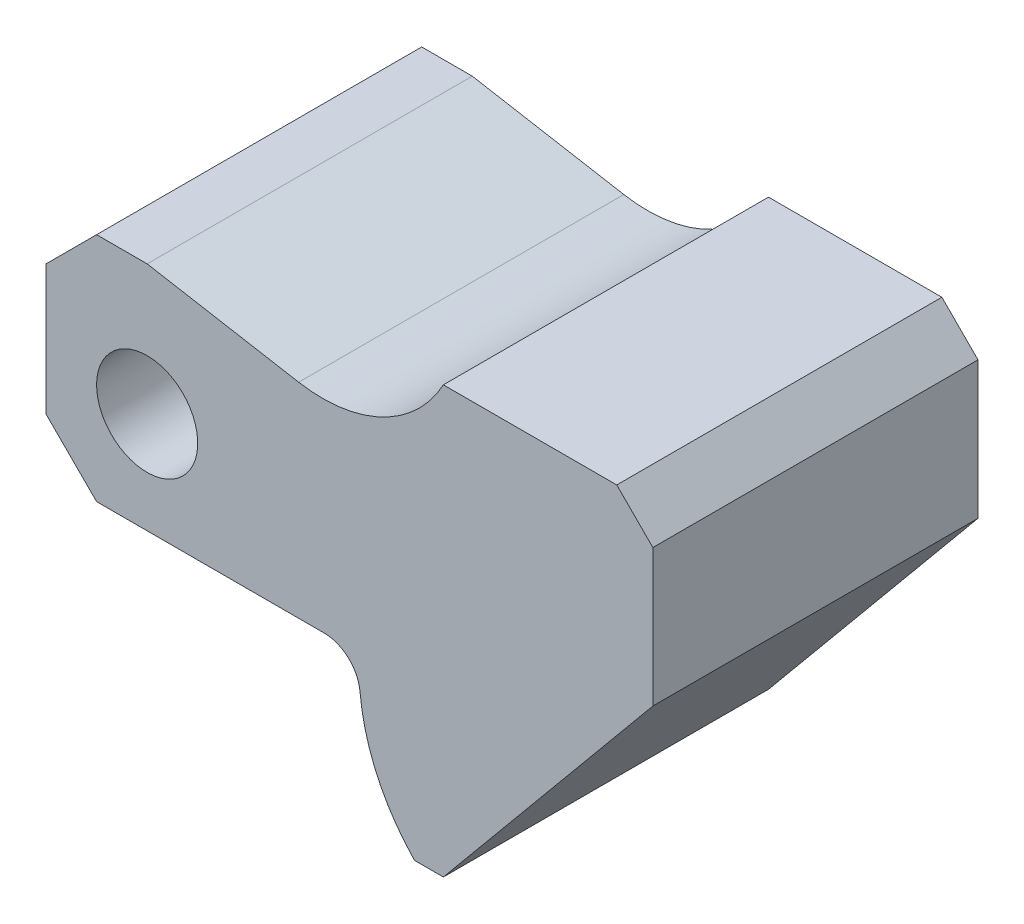
ISO-10303-21;
HEADER;
FILE_DESCRIPTION(('STEP AP214'),'2;1');
FILE_NAME('part.step','',(''),(''),'','','');
FILE_SCHEMA(('AUTOMOTIVE_DESIGN { 1 0 10303 214 1 1 1 1 }'));
ENDSEC;
DATA;
#1=APPLICATION_CONTEXT('core data for automotive mechanical design processes');
#2=APPLICATION_PROTOCOL_DEFINITION('international standard','automotive_design',2000,#1);
#3=PRODUCT_CONTEXT('',#1,'mechanical');
#4=PRODUCT('Part','Part','',(#3));
#5=PRODUCT_RELATED_PRODUCT_CATEGORY('part','',(#4));
#6=PRODUCT_DEFINITION_FORMATION('','',#4);
#7=PRODUCT_DEFINITION_CONTEXT('part definition',#1,'design');
#8=PRODUCT_DEFINITION('design','',#6,#7);
#9=PRODUCT_DEFINITION_SHAPE('','',#8);
#10=(LENGTH_UNIT() NAMED_UNIT(*) SI_UNIT(.MILLI.,.METRE.));
#11=(NAMED_UNIT(*) PLANE_ANGLE_UNIT() SI_UNIT($,.RADIAN.));
#12=(NAMED_UNIT(*) SI_UNIT($,.STERADIAN.) SOLID_ANGLE_UNIT());
#13=UNCERTAINTY_MEASURE_WITH_UNIT(LENGTH_MEASURE(1.E-05),#10,'distance_accuracy_value','');
#14=(GEOMETRIC_REPRESENTATION_CONTEXT(3) GLOBAL_UNCERTAINTY_ASSIGNED_CONTEXT((#13)) GLOBAL_UNIT_ASSIGNED_CONTEXT((#10,
#11,#12)) REPRESENTATION_CONTEXT('',''));
#15=CARTESIAN_POINT('',(0.,0.,0.));
#16=DIRECTION('',(0.,0.,1.));
#17=DIRECTION('',(1.,0.,0.));
#18=AXIS2_PLACEMENT_3D('',#15,#16,#17);
#19=CARTESIAN_POINT('',(16.7763702650457,10.4206472101089,45.));
#20=DIRECTION('',(0.,0.,-1.));
#21=DIRECTION('',(-1.,0.,0.));
#22=AXIS2_PLACEMENT_3D('',#19,#20,#21);
#23=PLANE('',#22);
#24=CARTESIAN_POINT('',(16.7763702650457,10.4206472101089,45.));
#25=DIRECTION('',(0.,0.,-1.));
#26=DIRECTION('',(-1.,0.,0.));
#27=AXIS2_PLACEMENT_3D('',#24,#25,#26);
#28=CIRCLE('',#27,19.);
#29=CARTESIAN_POINT('',(33.5025819868144,1.4076653817368,45.));
#30=VERTEX_POINT('',#29);
#31=CARTESIAN_POINT('',(13.477054889374,-8.29070009712305,45.));
#32=VERTEX_POINT('',#31);
#33=EDGE_CURVE('E224',#30,#32,#28,.T.);
#34=ORIENTED_EDGE('',*,*,#33,.T.);
#35=DIRECTION('',(-0.984807753012208,0.173648177666931,0.));
#36=VECTOR('',#35,1.);
#37=CARTESIAN_POINT('',(-7.49741801318557,-4.5923346182632,45.));
#38=LINE('',#37,#36);
#39=CARTESIAN_POINT('',(-7.49741801318557,-4.5923346182632,45.));
#40=VERTEX_POINT('',#39);
#41=EDGE_CURVE('E124',#32,#40,#38,.T.);
#42=ORIENTED_EDGE('',*,*,#41,.T.);
#43=DIRECTION('',(-1.,0.,0.));
#44=VECTOR('',#43,1.);
#45=CARTESIAN_POINT('',(-14.4974180131856,-4.5923346182632,45.));
#46=LINE('',#45,#44);
#47=CARTESIAN_POINT('',(-14.4974180131856,-4.5923346182632,45.));
#48=VERTEX_POINT('',#47);
#49=EDGE_CURVE('E269',#40,#48,#46,.T.);
#50=ORIENTED_EDGE('',*,*,#49,.T.);
#51=DIRECTION('',(-0.707106781186547,-0.707106781186547,0.));
#52=VECTOR('',#51,1.);
#53=CARTESIAN_POINT('',(-21.4974180131856,-11.5923346182632,45.));
#54=LINE('',#53,#52);
#55=CARTESIAN_POINT('',(-21.4974180131856,-11.5923346182632,45.));
#56=VERTEX_POINT('',#55);
#57=EDGE_CURVE('E289',#48,#56,#54,.T.);
#58=ORIENTED_EDGE('',*,*,#57,.T.);
#59=DIRECTION('',(0.,-1.,0.));
#60=VECTOR('',#59,1.);
#61=CARTESIAN_POINT('',(-21.4974180131856,-29.5923346182632,45.));
#62=LINE('',#61,#60);
#63=CARTESIAN_POINT('',(-21.4974180131856,-29.5923346182632,45.));
#64=VERTEX_POINT('',#63);
#65=EDGE_CURVE('E285',#56,#64,#62,.T.);
#66=ORIENTED_EDGE('',*,*,#65,.T.);
#67=DIRECTION('',(0.707106781186549,-0.707106781186547,0.));
#68=VECTOR('',#67,1.);
#69=CARTESIAN_POINT('',(-14.4974180131855,-36.5923346182632,45.));
#70=LINE('',#69,#68);
#71=CARTESIAN_POINT('',(-14.4974180131855,-36.5923346182632,45.));
#72=VERTEX_POINT('',#71);
#73=EDGE_CURVE('E288',#64,#72,#70,.T.);
#74=ORIENTED_EDGE('',*,*,#73,.T.);
#75=DIRECTION('',(1.,0.,0.));
#76=VECTOR('',#75,1.);
#77=CARTESIAN_POINT('',(16.9842529726912,-36.5923346182632,45.));
#78=LINE('',#77,#76);
#79=CARTESIAN_POINT('',(16.9842529726912,-36.5923346182632,45.));
#80=VERTEX_POINT('',#79);
#81=EDGE_CURVE('E293',#72,#80,#78,.T.);
#82=ORIENTED_EDGE('',*,*,#81,.T.);
#83=CARTESIAN_POINT('',(16.9842529726912,-41.5923346182632,45.));
#84=DIRECTION('',(0.,0.,-1.));
#85=DIRECTION('',(1.,0.,0.));
#86=AXIS2_PLACEMENT_3D('',#83,#84,#85);
#87=CIRCLE('',#86,5.);
#88=CARTESIAN_POINT('',(21.9627738596629,-41.1293769765869,45.));
#89=VERTEX_POINT('',#88);
#90=EDGE_CURVE('E300',#80,#89,#87,.T.);
#91=ORIENTED_EDGE('',*,*,#90,.T.);
#92=CARTESIAN_POINT('',(49.2454391296716,-38.5923346182632,45.));
#93=DIRECTION('',(0.,0.,1.));
#94=DIRECTION('',(-1.,0.,0.));
#95=AXIS2_PLACEMENT_3D('',#92,#93,#94);
#96=CIRCLE('',#95,27.4003724092076);
#97=CARTESIAN_POINT('',(29.5025819868144,-57.5923346182632,45.));
#98=VERTEX_POINT('',#97);
#99=EDGE_CURVE('E303',#89,#98,#96,.T.);
#100=ORIENTED_EDGE('',*,*,#99,.T.);
#101=DIRECTION('',(1.,0.,0.));
#102=VECTOR('',#101,1.);
#103=CARTESIAN_POINT('',(33.5025819868144,-57.5923346182632,45.));
#104=LINE('',#103,#102);
#105=CARTESIAN_POINT('',(33.5025819868144,-57.5923346182632,45.));
#106=VERTEX_POINT('',#105);
#107=EDGE_CURVE('E306',#98,#106,#104,.T.);
#108=ORIENTED_EDGE('',*,*,#107,.T.);
#109=DIRECTION('',(0.638017864750323,0.770021560905562,0.));
#110=VECTOR('',#109,1.);
#111=CARTESIAN_POINT('',(62.5025819868144,-22.5923346182632,45.));
#112=LINE('',#111,#110);
#113=CARTESIAN_POINT('',(62.5025819868144,-22.5923346182632,45.));
#114=VERTEX_POINT('',#113);
#115=EDGE_CURVE('E161',#106,#114,#112,.T.);
#116=ORIENTED_EDGE('',*,*,#115,.T.);
#117=DIRECTION('',(0.,1.,0.));
#118=VECTOR('',#117,1.);
#119=CARTESIAN_POINT('',(62.5025819868144,-3.5923346182632,45.));
#120=LINE('',#119,#118);
#121=CARTESIAN_POINT('',(62.5025819868144,-3.5923346182632,45.));
#122=VERTEX_POINT('',#121);
#123=EDGE_CURVE('E155',#114,#122,#120,.T.);
#124=ORIENTED_EDGE('',*,*,#123,.T.);
#125=DIRECTION('',(-0.707106781186547,0.707106781186548,0.));
#126=VECTOR('',#125,1.);
#127=CARTESIAN_POINT('',(57.5025819868144,1.4076653817368,45.));
#128=LINE('',#127,#126);
#129=CARTESIAN_POINT('',(57.5025819868144,1.4076653817368,45.));
#130=VERTEX_POINT('',#129);
#131=EDGE_CURVE('E159',#122,#130,#128,.T.);
#132=ORIENTED_EDGE('',*,*,#131,.T.);
#133=DIRECTION('',(-1.,0.,0.));
#134=VECTOR('',#133,1.);
#135=CARTESIAN_POINT('',(33.5025819868144,1.4076653817368,45.));
#136=LINE('',#135,#134);
#137=EDGE_CURVE('E63',#130,#30,#136,.T.);
#138=ORIENTED_EDGE('',*,*,#137,.T.);
#139=EDGE_LOOP('',(#34,#42,#50,#58,#66,#74,#82,#91,#100,#108,#116,#124,#132,#138));
#140=FACE_BOUND('',#139,.T.);
#141=CARTESIAN_POINT('',(-7.49741801318557,-22.5923346182632,45.));
#142=DIRECTION('',(0.,0.,1.));
#143=DIRECTION('',(1.,0.,0.));
#144=AXIS2_PLACEMENT_3D('',#141,#142,#143);
#145=CIRCLE('',#144,7.);
#146=CARTESIAN_POINT('',(-14.4974180131856,-22.5923346182632,45.));
#147=VERTEX_POINT('',#146);
#148=EDGE_CURVE('E188',#147,#147,#145,.T.);
#149=ORIENTED_EDGE('',*,*,#148,.F.);
#150=EDGE_LOOP('',(#149));
#151=FACE_BOUND('',#150,.T.);
#152=ADVANCED_FACE('F45',(#140,#151),#23,.F.);
#153=CARTESIAN_POINT('',(16.7763702650457,10.4206472101089,0.));
#154=DIRECTION('',(0.,0.,-1.));
#155=DIRECTION('',(-1.,0.,0.));
#156=AXIS2_PLACEMENT_3D('',#153,#154,#155);
#157=PLANE('',#156);
#158=CARTESIAN_POINT('',(16.7763702650457,10.4206472101089,0.));
#159=DIRECTION('',(0.,0.,-1.));
#160=DIRECTION('',(-1.,0.,0.));
#161=AXIS2_PLACEMENT_3D('',#158,#159,#160);
#162=CIRCLE('',#161,19.);
#163=CARTESIAN_POINT('',(33.5025819868144,1.4076653817368,0.));
#164=VERTEX_POINT('',#163);
#165=CARTESIAN_POINT('',(13.477054889374,-8.29070009712305,0.));
#166=VERTEX_POINT('',#165);
#167=EDGE_CURVE('E183',#164,#166,#162,.T.);
#168=ORIENTED_EDGE('',*,*,#167,.F.);
#169=DIRECTION('',(-1.,0.,0.));
#170=VECTOR('',#169,1.);
#171=CARTESIAN_POINT('',(33.5025819868144,1.4076653817368,0.));
#172=LINE('',#171,#170);
#173=CARTESIAN_POINT('',(57.5025819868144,1.4076653817368,0.));
#174=VERTEX_POINT('',#173);
#175=EDGE_CURVE('E116',#174,#164,#172,.T.);
#176=ORIENTED_EDGE('',*,*,#175,.F.);
#177=DIRECTION('',(-0.707106781186547,0.707106781186548,0.));
#178=VECTOR('',#177,1.);
#179=CARTESIAN_POINT('',(57.5025819868144,1.4076653817368,0.));
#180=LINE('',#179,#178);
#181=CARTESIAN_POINT('',(62.5025819868144,-3.5923346182632,0.));
#182=VERTEX_POINT('',#181);
#183=EDGE_CURVE('E110',#182,#174,#180,.T.);
#184=ORIENTED_EDGE('',*,*,#183,.F.);
#185=DIRECTION('',(0.,1.,0.));
#186=VECTOR('',#185,1.);
#187=CARTESIAN_POINT('',(62.5025819868144,-3.5923346182632,0.));
#188=LINE('',#187,#186);
#189=CARTESIAN_POINT('',(62.5025819868144,-22.5923346182632,0.));
#190=VERTEX_POINT('',#189);
#191=EDGE_CURVE('E170',#190,#182,#188,.T.);
#192=ORIENTED_EDGE('',*,*,#191,.F.);
#193=DIRECTION('',(0.638017864750323,0.770021560905562,0.));
#194=VECTOR('',#193,1.);
#195=CARTESIAN_POINT('',(62.5025819868144,-22.5923346182632,0.));
#196=LINE('',#195,#194);
#197=CARTESIAN_POINT('',(33.5025819868144,-57.5923346182632,0.));
#198=VERTEX_POINT('',#197);
#199=EDGE_CURVE('E215',#198,#190,#196,.T.);
#200=ORIENTED_EDGE('',*,*,#199,.F.);
#201=DIRECTION('',(1.,0.,0.));
#202=VECTOR('',#201,1.);
#203=CARTESIAN_POINT('',(33.5025819868144,-57.5923346182632,0.));
#204=LINE('',#203,#202);
#205=CARTESIAN_POINT('',(29.5025819868144,-57.5923346182632,0.));
#206=VERTEX_POINT('',#205);
#207=EDGE_CURVE('E212',#206,#198,#204,.T.);
#208=ORIENTED_EDGE('',*,*,#207,.F.);
#209=CARTESIAN_POINT('',(49.2454391296716,-38.5923346182632,0.));
#210=DIRECTION('',(0.,0.,1.));
#211=DIRECTION('',(-1.,0.,0.));
#212=AXIS2_PLACEMENT_3D('',#209,#210,#211);
#213=CIRCLE('',#212,27.4003724092076);
#214=CARTESIAN_POINT('',(21.9627738596629,-41.1293769765869,0.));
#215=VERTEX_POINT('',#214);
#216=EDGE_CURVE('E209',#215,#206,#213,.T.);
#217=ORIENTED_EDGE('',*,*,#216,.F.);
#218=CARTESIAN_POINT('',(16.9842529726912,-41.5923346182632,0.));
#219=DIRECTION('',(0.,0.,-1.));
#220=DIRECTION('',(1.,0.,0.));
#221=AXIS2_PLACEMENT_3D('',#218,#219,#220);
#222=CIRCLE('',#221,5.);
#223=CARTESIAN_POINT('',(16.9842529726912,-36.5923346182632,0.));
#224=VERTEX_POINT('',#223);
#225=EDGE_CURVE('E206',#224,#215,#222,.T.);
#226=ORIENTED_EDGE('',*,*,#225,.F.);
#227=DIRECTION('',(1.,0.,0.));
#228=VECTOR('',#227,1.);
#229=CARTESIAN_POINT('',(16.9842529726912,-36.5923346182632,0.));
#230=LINE('',#229,#228);
#231=CARTESIAN_POINT('',(-14.4974180131855,-36.5923346182632,0.));
#232=VERTEX_POINT('',#231);
#233=EDGE_CURVE('E203',#232,#224,#230,.T.);
#234=ORIENTED_EDGE('',*,*,#233,.F.);
#235=DIRECTION('',(0.707106781186549,-0.707106781186547,0.));
#236=VECTOR('',#235,1.);
#237=CARTESIAN_POINT('',(-14.4974180131855,-36.5923346182632,0.));
#238=LINE('',#237,#236);
#239=CARTESIAN_POINT('',(-21.4974180131856,-29.5923346182632,0.));
#240=VERTEX_POINT('',#239);
#241=EDGE_CURVE('E200',#240,#232,#238,.T.);
#242=ORIENTED_EDGE('',*,*,#241,.F.);
#243=DIRECTION('',(0.,-1.,0.));
#244=VECTOR('',#243,1.);
#245=CARTESIAN_POINT('',(-21.4974180131856,-29.5923346182632,0.));
#246=LINE('',#245,#244);
#247=CARTESIAN_POINT('',(-21.4974180131856,-11.5923346182632,0.));
#248=VERTEX_POINT('',#247);
#249=EDGE_CURVE('E197',#248,#240,#246,.T.);
#250=ORIENTED_EDGE('',*,*,#249,.F.);
#251=DIRECTION('',(-0.707106781186547,-0.707106781186547,0.));
#252=VECTOR('',#251,1.);
#253=CARTESIAN_POINT('',(-21.4974180131856,-11.5923346182632,0.));
#254=LINE('',#253,#252);
#255=CARTESIAN_POINT('',(-14.4974180131856,-4.5923346182632,0.));
#256=VERTEX_POINT('',#255);
#257=EDGE_CURVE('E194',#256,#248,#254,.T.);
#258=ORIENTED_EDGE('',*,*,#257,.F.);
#259=DIRECTION('',(-1.,0.,0.));
#260=VECTOR('',#259,1.);
#261=CARTESIAN_POINT('',(-14.4974180131856,-4.5923346182632,0.));
#262=LINE('',#261,#260);
#263=CARTESIAN_POINT('',(-7.49741801318557,-4.5923346182632,0.));
#264=VERTEX_POINT('',#263);
#265=EDGE_CURVE('E191',#264,#256,#262,.T.);
#266=ORIENTED_EDGE('',*,*,#265,.F.);
#267=DIRECTION('',(-0.984807753012208,0.173648177666931,0.));
#268=VECTOR('',#267,1.);
#269=CARTESIAN_POINT('',(-7.49741801318557,-4.5923346182632,0.));
#270=LINE('',#269,#268);
#271=EDGE_CURVE('E187',#166,#264,#270,.T.);
#272=ORIENTED_EDGE('',*,*,#271,.F.);
#273=EDGE_LOOP('',(#168,#176,#184,#192,#200,#208,#217,#226,#234,#242,#250,#258,#266,#272));
#274=FACE_BOUND('',#273,.T.);
#275=CARTESIAN_POINT('',(-7.49741801318557,-22.5923346182632,0.));
#276=DIRECTION('',(0.,0.,1.));
#277=DIRECTION('',(1.,0.,0.));
#278=AXIS2_PLACEMENT_3D('',#275,#276,#277);
#279=CIRCLE('',#278,7.);
#280=CARTESIAN_POINT('',(-14.4974180131856,-22.5923346182632,0.));
#281=VERTEX_POINT('',#280);
#282=EDGE_CURVE('E481',#281,#281,#279,.T.);
#283=ORIENTED_EDGE('',*,*,#282,.T.);
#284=EDGE_LOOP('',(#283));
#285=FACE_BOUND('',#284,.T.);
#286=ADVANCED_FACE('F273',(#274,#285),#157,.T.);
#287=CARTESIAN_POINT('',(16.7763702650457,10.4206472101089,45.));
#288=DIRECTION('',(0.,0.,-1.));
#289=DIRECTION('',(-1.,0.,0.));
#290=AXIS2_PLACEMENT_3D('',#287,#288,#289);
#291=CYLINDRICAL_SURFACE('',#290,19.);
#292=ORIENTED_EDGE('',*,*,#167,.T.);
#293=DIRECTION('',(0.,0.,-1.));
#294=VECTOR('',#293,1.);
#295=CARTESIAN_POINT('',(13.477054889374,-8.29070009712305,45.));
#296=LINE('',#295,#294);
#297=EDGE_CURVE('E11',#32,#166,#296,.T.);
#298=ORIENTED_EDGE('',*,*,#297,.F.);
#299=ORIENTED_EDGE('',*,*,#33,.F.);
#300=DIRECTION('',(0.,0.,-1.));
#301=VECTOR('',#300,1.);
#302=CARTESIAN_POINT('',(33.5025819868144,1.4076653817368,45.));
#303=LINE('',#302,#301);
#304=EDGE_CURVE('E179',#30,#164,#303,.T.);
#305=ORIENTED_EDGE('',*,*,#304,.T.);
#306=EDGE_LOOP('',(#292,#298,#299,#305));
#307=FACE_BOUND('',#306,.T.);
#308=ADVANCED_FACE('F47',(#307),#291,.F.);
#309=CARTESIAN_POINT('',(-7.49741801318557,-4.5923346182632,45.));
#310=DIRECTION('',(-0.173648177666931,-0.984807753012208,0.));
#311=DIRECTION('',(0.984807753012208,-0.173648177666931,0.));
#312=AXIS2_PLACEMENT_3D('',#309,#310,#311);
#313=PLANE('',#312);
#314=ORIENTED_EDGE('',*,*,#271,.T.);
#315=DIRECTION('',(0.,0.,-1.));
#316=VECTOR('',#315,1.);
#317=CARTESIAN_POINT('',(-7.49741801318557,-4.5923346182632,45.));
#318=LINE('',#317,#316);
#319=EDGE_CURVE('E55',#40,#264,#318,.T.);
#320=ORIENTED_EDGE('',*,*,#319,.F.);
#321=ORIENTED_EDGE('',*,*,#41,.F.);
#322=ORIENTED_EDGE('',*,*,#297,.T.);
#323=EDGE_LOOP('',(#314,#320,#321,#322));
#324=FACE_BOUND('',#323,.T.);
#325=ADVANCED_FACE('F342',(#324),#313,.F.);
#326=CARTESIAN_POINT('',(-14.4974180131856,-4.5923346182632,45.));
#327=DIRECTION('',(0.,-1.,0.));
#328=DIRECTION('',(0.,0.,-1.));
#329=AXIS2_PLACEMENT_3D('',#326,#327,#328);
#330=PLANE('',#329);
#331=ORIENTED_EDGE('',*,*,#265,.T.);
#332=DIRECTION('',(0.,0.,-1.));
#333=VECTOR('',#332,1.);
#334=CARTESIAN_POINT('',(-14.4974180131856,-4.5923346182632,45.));
#335=LINE('',#334,#333);
#336=EDGE_CURVE('E259',#48,#256,#335,.T.);
#337=ORIENTED_EDGE('',*,*,#336,.F.);
#338=ORIENTED_EDGE('',*,*,#49,.F.);
#339=ORIENTED_EDGE('',*,*,#319,.T.);
#340=EDGE_LOOP('',(#331,#337,#338,#339));
#341=FACE_BOUND('',#340,.T.);
#342=ADVANCED_FACE('F267',(#341),#330,.F.);
#343=CARTESIAN_POINT('',(-21.4974180131856,-11.5923346182632,45.));
#344=DIRECTION('',(0.707106781186547,-0.707106781186547,0.));
#345=DIRECTION('',(0.707106781186548,0.707106781186548,0.));
#346=AXIS2_PLACEMENT_3D('',#343,#344,#345);
#347=PLANE('',#346);
#348=ORIENTED_EDGE('',*,*,#257,.T.);
#349=DIRECTION('',(0.,0.,-1.));
#350=VECTOR('',#349,1.);
#351=CARTESIAN_POINT('',(-21.4974180131856,-11.5923346182632,45.));
#352=LINE('',#351,#350);
#353=EDGE_CURVE('E255',#56,#248,#352,.T.);
#354=ORIENTED_EDGE('',*,*,#353,.F.);
#355=ORIENTED_EDGE('',*,*,#57,.F.);
#356=ORIENTED_EDGE('',*,*,#336,.T.);
#357=EDGE_LOOP('',(#348,#354,#355,#356));
#358=FACE_BOUND('',#357,.T.);
#359=ADVANCED_FACE('F279',(#358),#347,.F.);
#360=CARTESIAN_POINT('',(-21.4974180131856,-29.5923346182632,45.));
#361=DIRECTION('',(1.,0.,0.));
#362=DIRECTION('',(0.,1.,0.));
#363=AXIS2_PLACEMENT_3D('',#360,#361,#362);
#364=PLANE('',#363);
#365=ORIENTED_EDGE('',*,*,#249,.T.);
#366=DIRECTION('',(0.,0.,-1.));
#367=VECTOR('',#366,1.);
#368=CARTESIAN_POINT('',(-21.4974180131856,-29.5923346182632,45.));
#369=LINE('',#368,#367);
#370=EDGE_CURVE('E251',#64,#240,#369,.T.);
#371=ORIENTED_EDGE('',*,*,#370,.F.);
#372=ORIENTED_EDGE('',*,*,#65,.F.);
#373=ORIENTED_EDGE('',*,*,#353,.T.);
#374=EDGE_LOOP('',(#365,#371,#372,#373));
#375=FACE_BOUND('',#374,.T.);
#376=ADVANCED_FACE('F283',(#375),#364,.F.);
#377=CARTESIAN_POINT('',(-14.4974180131855,-36.5923346182632,45.));
#378=DIRECTION('',(0.707106781186546,0.707106781186548,0.));
#379=DIRECTION('',(-0.707106781186549,0.707106781186547,0.));
#380=AXIS2_PLACEMENT_3D('',#377,#378,#379);
#381=PLANE('',#380);
#382=ORIENTED_EDGE('',*,*,#241,.T.);
#383=DIRECTION('',(0.,0.,-1.));
#384=VECTOR('',#383,1.);
#385=CARTESIAN_POINT('',(-14.4974180131855,-36.5923346182632,45.));
#386=LINE('',#385,#384);
#387=EDGE_CURVE('E247',#72,#232,#386,.T.);
#388=ORIENTED_EDGE('',*,*,#387,.F.);
#389=ORIENTED_EDGE('',*,*,#73,.F.);
#390=ORIENTED_EDGE('',*,*,#370,.T.);
#391=EDGE_LOOP('',(#382,#388,#389,#390));
#392=FACE_BOUND('',#391,.T.);
#393=ADVANCED_FACE('F355',(#392),#381,.F.);
#394=CARTESIAN_POINT('',(16.9842529726912,-36.5923346182632,45.));
#395=DIRECTION('',(0.,1.,0.));
#396=DIRECTION('',(0.,0.,1.));
#397=AXIS2_PLACEMENT_3D('',#394,#395,#396);
#398=PLANE('',#397);
#399=ORIENTED_EDGE('',*,*,#233,.T.);
#400=DIRECTION('',(0.,0.,-1.));
#401=VECTOR('',#400,1.);
#402=CARTESIAN_POINT('',(16.9842529726912,-36.5923346182632,45.));
#403=LINE('',#402,#401);
#404=EDGE_CURVE('E243',#80,#224,#403,.T.);
#405=ORIENTED_EDGE('',*,*,#404,.F.);
#406=ORIENTED_EDGE('',*,*,#81,.F.);
#407=ORIENTED_EDGE('',*,*,#387,.T.);
#408=EDGE_LOOP('',(#399,#405,#406,#407));
#409=FACE_BOUND('',#408,.T.);
#410=ADVANCED_FACE('F358',(#409),#398,.F.);
#411=CARTESIAN_POINT('',(16.9842529726912,-41.5923346182632,45.));
#412=DIRECTION('',(0.,0.,-1.));
#413=DIRECTION('',(-1.,0.,0.));
#414=AXIS2_PLACEMENT_3D('',#411,#412,#413);
#415=CYLINDRICAL_SURFACE('',#414,5.);
#416=ORIENTED_EDGE('',*,*,#225,.T.);
#417=DIRECTION('',(0.,0.,-1.));
#418=VECTOR('',#417,1.);
#419=CARTESIAN_POINT('',(21.9627738596629,-41.1293769765869,45.));
#420=LINE('',#419,#418);
#421=EDGE_CURVE('E239',#89,#215,#420,.T.);
#422=ORIENTED_EDGE('',*,*,#421,.F.);
#423=ORIENTED_EDGE('',*,*,#90,.F.);
#424=ORIENTED_EDGE('',*,*,#404,.T.);
#425=EDGE_LOOP('',(#416,#422,#423,#424));
#426=FACE_BOUND('',#425,.T.);
#427=ADVANCED_FACE('F362',(#426),#415,.F.);
#428=CARTESIAN_POINT('',(49.2454391296716,-38.5923346182632,45.));
#429=DIRECTION('',(0.,0.,-1.));
#430=DIRECTION('',(-1.,0.,0.));
#431=AXIS2_PLACEMENT_3D('',#428,#429,#430);
#432=CYLINDRICAL_SURFACE('',#431,27.4003724092076);
#433=ORIENTED_EDGE('',*,*,#216,.T.);
#434=DIRECTION('',(0.,0.,-1.));
#435=VECTOR('',#434,1.);
#436=CARTESIAN_POINT('',(29.5025819868144,-57.5923346182632,45.));
#437=LINE('',#436,#435);
#438=EDGE_CURVE('E235',#98,#206,#437,.T.);
#439=ORIENTED_EDGE('',*,*,#438,.F.);
#440=ORIENTED_EDGE('',*,*,#99,.F.);
#441=ORIENTED_EDGE('',*,*,#421,.T.);
#442=EDGE_LOOP('',(#433,#439,#440,#441));
#443=FACE_BOUND('',#442,.T.);
#444=ADVANCED_FACE('F366',(#443),#432,.T.);
#445=CARTESIAN_POINT('',(33.5025819868144,-57.5923346182632,45.));
#446=DIRECTION('',(0.,1.,0.));
#447=DIRECTION('',(-1.,0.,0.));
#448=AXIS2_PLACEMENT_3D('',#445,#446,#447);
#449=PLANE('',#448);
#450=ORIENTED_EDGE('',*,*,#207,.T.);
#451=DIRECTION('',(0.,0.,-1.));
#452=VECTOR('',#451,1.);
#453=CARTESIAN_POINT('',(33.5025819868144,-57.5923346182632,45.));
#454=LINE('',#453,#452);
#455=EDGE_CURVE('E231',#106,#198,#454,.T.);
#456=ORIENTED_EDGE('',*,*,#455,.F.);
#457=ORIENTED_EDGE('',*,*,#107,.F.);
#458=ORIENTED_EDGE('',*,*,#438,.T.);
#459=EDGE_LOOP('',(#450,#456,#457,#458));
#460=FACE_BOUND('',#459,.T.);
#461=ADVANCED_FACE('F314',(#460),#449,.F.);
#462=CARTESIAN_POINT('',(62.5025819868144,-22.5923346182632,45.));
#463=DIRECTION('',(-0.770021560905562,0.638017864750323,0.));
#464=DIRECTION('',(-0.638017864750323,-0.770021560905562,0.));
#465=AXIS2_PLACEMENT_3D('',#462,#463,#464);
#466=PLANE('',#465);
#467=ORIENTED_EDGE('',*,*,#199,.T.);
#468=DIRECTION('',(0.,0.,-1.));
#469=VECTOR('',#468,1.);
#470=CARTESIAN_POINT('',(62.5025819868144,-22.5923346182632,45.));
#471=LINE('',#470,#469);
#472=EDGE_CURVE('E172',#114,#190,#471,.T.);
#473=ORIENTED_EDGE('',*,*,#472,.F.);
#474=ORIENTED_EDGE('',*,*,#115,.F.);
#475=ORIENTED_EDGE('',*,*,#455,.T.);
#476=EDGE_LOOP('',(#467,#473,#474,#475));
#477=FACE_BOUND('',#476,.T.);
#478=ADVANCED_FACE('F318',(#477),#466,.F.);
#479=CARTESIAN_POINT('',(62.5025819868144,-3.5923346182632,45.));
#480=DIRECTION('',(-1.,0.,0.));
#481=DIRECTION('',(0.,0.,1.));
#482=AXIS2_PLACEMENT_3D('',#479,#480,#481);
#483=PLANE('',#482);
#484=ORIENTED_EDGE('',*,*,#191,.T.);
#485=DIRECTION('',(0.,0.,-1.));
#486=VECTOR('',#485,1.);
#487=CARTESIAN_POINT('',(62.5025819868144,-3.5923346182632,45.));
#488=LINE('',#487,#486);
#489=EDGE_CURVE('E167',#122,#182,#488,.T.);
#490=ORIENTED_EDGE('',*,*,#489,.F.);
#491=ORIENTED_EDGE('',*,*,#123,.F.);
#492=ORIENTED_EDGE('',*,*,#472,.T.);
#493=EDGE_LOOP('',(#484,#490,#491,#492));
#494=FACE_BOUND('',#493,.T.);
#495=ADVANCED_FACE('F168',(#494),#483,.F.);
#496=CARTESIAN_POINT('',(57.5025819868144,1.4076653817368,45.));
#497=DIRECTION('',(-0.707106781186548,-0.707106781186547,0.));
#498=DIRECTION('',(0.707106781186547,-0.707106781186548,0.));
#499=AXIS2_PLACEMENT_3D('',#496,#497,#498);
#500=PLANE('',#499);
#501=ORIENTED_EDGE('',*,*,#183,.T.);
#502=DIRECTION('',(0.,0.,-1.));
#503=VECTOR('',#502,1.);
#504=CARTESIAN_POINT('',(57.5025819868144,1.4076653817368,45.));
#505=LINE('',#504,#503);
#506=EDGE_CURVE('E173',#130,#174,#505,.T.);
#507=ORIENTED_EDGE('',*,*,#506,.F.);
#508=ORIENTED_EDGE('',*,*,#131,.F.);
#509=ORIENTED_EDGE('',*,*,#489,.T.);
#510=EDGE_LOOP('',(#501,#507,#508,#509));
#511=FACE_BOUND('',#510,.T.);
#512=ADVANCED_FACE('F175',(#511),#500,.F.);
#513=CARTESIAN_POINT('',(33.5025819868144,1.4076653817368,45.));
#514=DIRECTION('',(0.,-1.,0.));
#515=DIRECTION('',(0.,0.,-1.));
#516=AXIS2_PLACEMENT_3D('',#513,#514,#515);
#517=PLANE('',#516);
#518=ORIENTED_EDGE('',*,*,#175,.T.);
#519=ORIENTED_EDGE('',*,*,#304,.F.);
#520=ORIENTED_EDGE('',*,*,#137,.F.);
#521=ORIENTED_EDGE('',*,*,#506,.T.);
#522=EDGE_LOOP('',(#518,#519,#520,#521));
#523=FACE_BOUND('',#522,.T.);
#524=ADVANCED_FACE('F322',(#523),#517,.F.);
#525=CARTESIAN_POINT('',(-7.49741801318557,-22.5923346182632,45.));
#526=DIRECTION('',(0.,0.,-1.));
#527=DIRECTION('',(-1.,0.,0.));
#528=AXIS2_PLACEMENT_3D('',#525,#526,#527);
#529=CYLINDRICAL_SURFACE('',#528,7.);
#530=CARTESIAN_POINT('',(-14.4974180131856,-22.5923346182632,45.));
#531=CARTESIAN_POINT('',(-14.4974180131856,-22.5923346182632,44.53125));
#532=CARTESIAN_POINT('',(-14.4974180131856,-22.5923346182632,44.0625));
#533=CARTESIAN_POINT('',(-14.4974180131856,-22.5923346182632,43.125));
#534=CARTESIAN_POINT('',(-14.4974180131856,-22.5923346182632,42.65625));
#535=CARTESIAN_POINT('',(-14.4974180131856,-22.5923346182632,41.71875));
#536=CARTESIAN_POINT('',(-14.4974180131856,-22.5923346182632,41.25));
#537=CARTESIAN_POINT('',(-14.4974180131856,-22.5923346182632,40.3125));
#538=CARTESIAN_POINT('',(-14.4974180131856,-22.5923346182632,39.84375));
#539=CARTESIAN_POINT('',(-14.4974180131856,-22.5923346182632,38.90625));
#540=CARTESIAN_POINT('',(-14.4974180131856,-22.5923346182632,38.4375));
#541=CARTESIAN_POINT('',(-14.4974180131856,-22.5923346182632,37.5));
#542=CARTESIAN_POINT('',(-14.4974180131856,-22.5923346182632,37.03125));
#543=CARTESIAN_POINT('',(-14.4974180131856,-22.5923346182632,36.09375));
#544=CARTESIAN_POINT('',(-14.4974180131856,-22.5923346182632,35.625));
#545=CARTESIAN_POINT('',(-14.4974180131856,-22.5923346182632,34.6875));
#546=CARTESIAN_POINT('',(-14.4974180131856,-22.5923346182632,34.21875));
#547=CARTESIAN_POINT('',(-14.4974180131856,-22.5923346182632,33.28125));
#548=CARTESIAN_POINT('',(-14.4974180131856,-22.5923346182632,32.8125));
#549=CARTESIAN_POINT('',(-14.4974180131856,-22.5923346182632,31.875));
#550=CARTESIAN_POINT('',(-14.4974180131856,-22.5923346182632,31.40625));
#551=CARTESIAN_POINT('',(-14.4974180131856,-22.5923346182632,30.46875));
#552=CARTESIAN_POINT('',(-14.4974180131856,-22.5923346182632,30.));
#553=CARTESIAN_POINT('',(-14.4974180131856,-22.5923346182632,29.0625));
#554=CARTESIAN_POINT('',(-14.4974180131856,-22.5923346182632,28.59375));
#555=CARTESIAN_POINT('',(-14.4974180131856,-22.5923346182632,27.65625));
#556=CARTESIAN_POINT('',(-14.4974180131856,-22.5923346182632,27.1875));
#557=CARTESIAN_POINT('',(-14.4974180131856,-22.5923346182632,26.25));
#558=CARTESIAN_POINT('',(-14.4974180131856,-22.5923346182632,25.78125));
#559=CARTESIAN_POINT('',(-14.4974180131856,-22.5923346182632,24.84375));
#560=CARTESIAN_POINT('',(-14.4974180131856,-22.5923346182632,24.375));
#561=CARTESIAN_POINT('',(-14.4974180131856,-22.5923346182632,23.4375));
#562=CARTESIAN_POINT('',(-14.4974180131856,-22.5923346182632,22.96875));
#563=CARTESIAN_POINT('',(-14.4974180131856,-22.5923346182632,22.03125));
#564=CARTESIAN_POINT('',(-14.4974180131856,-22.5923346182632,21.5625));
#565=CARTESIAN_POINT('',(-14.4974180131856,-22.5923346182632,20.625));
#566=CARTESIAN_POINT('',(-14.4974180131856,-22.5923346182632,20.15625));
#567=CARTESIAN_POINT('',(-14.4974180131856,-22.5923346182632,19.21875));
#568=CARTESIAN_POINT('',(-14.4974180131856,-22.5923346182632,18.75));
#569=CARTESIAN_POINT('',(-14.4974180131856,-22.5923346182632,17.8125));
#570=CARTESIAN_POINT('',(-14.4974180131856,-22.5923346182632,17.34375));
#571=CARTESIAN_POINT('',(-14.4974180131856,-22.5923346182632,16.40625));
#572=CARTESIAN_POINT('',(-14.4974180131856,-22.5923346182632,15.9375));
#573=CARTESIAN_POINT('',(-14.4974180131856,-22.5923346182632,15.));
#574=CARTESIAN_POINT('',(-14.4974180131856,-22.5923346182632,14.53125));
#575=CARTESIAN_POINT('',(-14.4974180131856,-22.5923346182632,13.59375));
#576=CARTESIAN_POINT('',(-14.4974180131856,-22.5923346182632,13.125));
#577=CARTESIAN_POINT('',(-14.4974180131856,-22.5923346182632,12.1875));
#578=CARTESIAN_POINT('',(-14.4974180131856,-22.5923346182632,11.71875));
#579=CARTESIAN_POINT('',(-14.4974180131856,-22.5923346182632,10.78125));
#580=CARTESIAN_POINT('',(-14.4974180131856,-22.5923346182632,10.3125));
#581=CARTESIAN_POINT('',(-14.4974180131856,-22.5923346182632,9.375));
#582=CARTESIAN_POINT('',(-14.4974180131856,-22.5923346182632,8.90625));
#583=CARTESIAN_POINT('',(-14.4974180131856,-22.5923346182632,7.96874999999999));
#584=CARTESIAN_POINT('',(-14.4974180131856,-22.5923346182632,7.5));
#585=CARTESIAN_POINT('',(-14.4974180131856,-22.5923346182632,6.5625));
#586=CARTESIAN_POINT('',(-14.4974180131856,-22.5923346182632,6.09375));
#587=CARTESIAN_POINT('',(-14.4974180131856,-22.5923346182632,5.15625));
#588=CARTESIAN_POINT('',(-14.4974180131856,-22.5923346182632,4.68749999999999));
#589=CARTESIAN_POINT('',(-14.4974180131856,-22.5923346182632,3.74999999999999));
#590=CARTESIAN_POINT('',(-14.4974180131856,-22.5923346182632,3.28124999999999));
#591=CARTESIAN_POINT('',(-14.4974180131856,-22.5923346182632,2.34374999999999));
#592=CARTESIAN_POINT('',(-14.4974180131856,-22.5923346182632,1.87499999999999));
#593=CARTESIAN_POINT('',(-14.4974180131856,-22.5923346182632,0.937499999999992));
#594=CARTESIAN_POINT('',(-14.4974180131856,-22.5923346182632,0.468749999999993));
#595=CARTESIAN_POINT('',(-14.4974180131856,-22.5923346182632,0.));
#596=B_SPLINE_CURVE_WITH_KNOTS('',3,(#530,#531,#532,#533,#534,#535,#536,#537,#538,#539,#540,
#541,#542,#543,#544,#545,#546,#547,#548,#549,#550,#551,#552,#553,#554,#555,#556,#557,#558,#559,
#560,#561,#562,#563,#564,#565,#566,#567,#568,#569,#570,#571,#572,#573,#574,#575,#576,#577,#578,
#579,#580,#581,#582,#583,#584,#585,#586,#587,#588,#589,#590,#591,#592,#593,#594,#595),
.UNSPECIFIED.,.F.,.F.,(4,2,2,2,2,2,2,2,2,2,2,2,2,2,2,2,2,2,2,2,2,2,2,2,2,2,2,2,2,2,2,2,4),(0.,
1.40625,2.8125,4.21875000000001,5.62500000000001,7.03125,8.4375,9.84375000000001,11.25,12.65625,
14.0625,15.46875,16.875,18.28125,19.6875,21.09375,22.5,23.90625,25.3125,26.71875,28.125,
29.53125,30.9375,32.34375,33.75,35.15625,36.5625,37.96875,39.375,40.78125,42.1875,43.59375,45.),.UNSPECIFIED.);
#597=EDGE_CURVE('BSEAM324',#147,#281,#596,.T.);
#598=ORIENTED_EDGE('',*,*,#148,.T.);
#599=ORIENTED_EDGE('',*,*,#282,.F.);
#600=ORIENTED_EDGE('',*,*,#597,.T.);
#601=ORIENTED_EDGE('',*,*,#597,.F.);
#602=EDGE_LOOP('',(#598,#600,#599,#601));
#603=FACE_BOUND('',#602,.T.);
#604=ADVANCED_FACE('F324',(#603),#529,.F.);
#605=CLOSED_SHELL('',(#152,#286,#308,#325,#342,#359,#376,#393,#410,#427,#444,#461,#478,#495,
#512,#524,#604));
#606=MANIFOLD_SOLID_BREP('B2',#605);
#607=ADVANCED_BREP_SHAPE_REPRESENTATION('',(#18,#606),#14);
#608=SHAPE_DEFINITION_REPRESENTATION(#9,#607);
ENDSEC;
END-ISO-10303-21;
